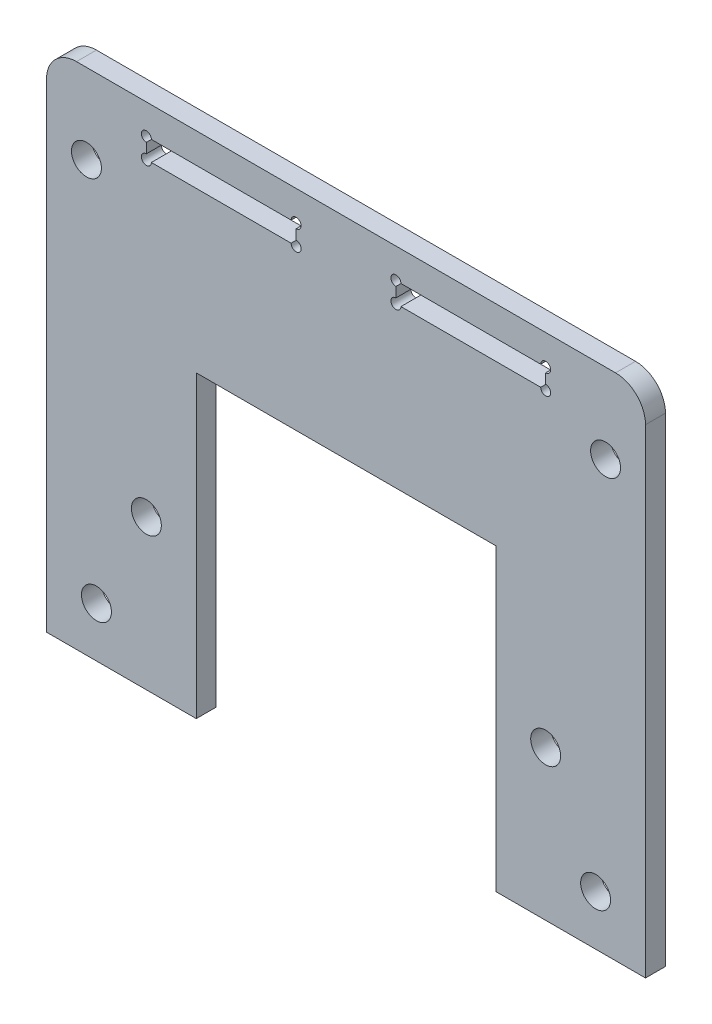
ISO-10303-21;
HEADER;
FILE_DESCRIPTION(('STEP AP214'),'2;1');
FILE_NAME('part.step','',(''),(''),'','','');
FILE_SCHEMA(('AUTOMOTIVE_DESIGN { 1 0 10303 214 1 1 1 1 }'));
ENDSEC;
DATA;
#1=APPLICATION_CONTEXT('core data for automotive mechanical design processes');
#2=APPLICATION_PROTOCOL_DEFINITION('international standard','automotive_design',2000,#1);
#3=PRODUCT_CONTEXT('',#1,'mechanical');
#4=PRODUCT('Part','Part','',(#3));
#5=PRODUCT_RELATED_PRODUCT_CATEGORY('part','',(#4));
#6=PRODUCT_DEFINITION_FORMATION('','',#4);
#7=PRODUCT_DEFINITION_CONTEXT('part definition',#1,'design');
#8=PRODUCT_DEFINITION('design','',#6,#7);
#9=PRODUCT_DEFINITION_SHAPE('','',#8);
#10=(LENGTH_UNIT() NAMED_UNIT(*) SI_UNIT(.MILLI.,.METRE.));
#11=(NAMED_UNIT(*) PLANE_ANGLE_UNIT() SI_UNIT($,.RADIAN.));
#12=(NAMED_UNIT(*) SI_UNIT($,.STERADIAN.) SOLID_ANGLE_UNIT());
#13=UNCERTAINTY_MEASURE_WITH_UNIT(LENGTH_MEASURE(1.E-05),#10,'distance_accuracy_value','');
#14=(GEOMETRIC_REPRESENTATION_CONTEXT(3) GLOBAL_UNCERTAINTY_ASSIGNED_CONTEXT((#13)) GLOBAL_UNIT_ASSIGNED_CONTEXT((#10,
#11,#12)) REPRESENTATION_CONTEXT('',''));
#15=CARTESIAN_POINT('',(0.,0.,0.));
#16=DIRECTION('',(0.,0.,1.));
#17=DIRECTION('',(1.,0.,0.));
#18=AXIS2_PLACEMENT_3D('',#15,#16,#17);
#19=CARTESIAN_POINT('',(20.,24.,-8.));
#20=DIRECTION('',(-1.,0.,0.));
#21=DIRECTION('',(0.,0.,1.));
#22=AXIS2_PLACEMENT_3D('',#19,#20,#21);
#23=PLANE('',#22);
#24=DIRECTION('',(0.,0.,1.));
#25=VECTOR('',#24,1.);
#26=CARTESIAN_POINT('',(20.,22.5,-8.));
#27=LINE('',#26,#25);
#28=CARTESIAN_POINT('',(20.,22.5,0.));
#29=VERTEX_POINT('',#28);
#30=CARTESIAN_POINT('',(20.,22.5,2.));
#31=VERTEX_POINT('',#30);
#32=EDGE_CURVE('E211',#29,#31,#27,.T.);
#33=ORIENTED_EDGE('',*,*,#32,.T.);
#34=DIRECTION('',(0.,1.,0.));
#35=VECTOR('',#34,1.);
#36=CARTESIAN_POINT('',(20.,24.,2.));
#37=LINE('',#36,#35);
#38=CARTESIAN_POINT('',(20.,23.5,2.));
#39=VERTEX_POINT('',#38);
#40=EDGE_CURVE('E198',#31,#39,#37,.T.);
#41=ORIENTED_EDGE('',*,*,#40,.T.);
#42=DIRECTION('',(0.,0.,1.));
#43=VECTOR('',#42,1.);
#44=CARTESIAN_POINT('',(20.,23.5,0.));
#45=LINE('',#44,#43);
#46=CARTESIAN_POINT('',(20.,23.5,0.));
#47=VERTEX_POINT('',#46);
#48=EDGE_CURVE('E209',#39,#47,#45,.F.);
#49=ORIENTED_EDGE('',*,*,#48,.T.);
#50=DIRECTION('',(0.,1.,0.));
#51=VECTOR('',#50,1.);
#52=CARTESIAN_POINT('',(20.,24.,0.));
#53=LINE('',#52,#51);
#54=EDGE_CURVE('E213',#47,#29,#53,.F.);
#55=ORIENTED_EDGE('',*,*,#54,.T.);
#56=EDGE_LOOP('',(#33,#41,#49,#55));
#57=FACE_BOUND('',#56,.T.);
#58=ADVANCED_FACE('F17',(#57),#23,.T.);
#59=CARTESIAN_POINT('',(-5.,24.,-8.));
#60=DIRECTION('',(-1.,0.,0.));
#61=DIRECTION('',(0.,0.,1.));
#62=AXIS2_PLACEMENT_3D('',#59,#60,#61);
#63=PLANE('',#62);
#64=DIRECTION('',(0.,0.,1.));
#65=VECTOR('',#64,1.);
#66=CARTESIAN_POINT('',(-5.,22.5,-8.));
#67=LINE('',#66,#65);
#68=CARTESIAN_POINT('',(-5.,22.5,0.));
#69=VERTEX_POINT('',#68);
#70=CARTESIAN_POINT('',(-5.,22.5,2.));
#71=VERTEX_POINT('',#70);
#72=EDGE_CURVE('E205',#69,#71,#67,.T.);
#73=ORIENTED_EDGE('',*,*,#72,.T.);
#74=DIRECTION('',(0.,1.,0.));
#75=VECTOR('',#74,1.);
#76=CARTESIAN_POINT('',(-5.,24.,2.));
#77=LINE('',#76,#75);
#78=CARTESIAN_POINT('',(-5.,23.5,2.));
#79=VERTEX_POINT('',#78);
#80=EDGE_CURVE('E216',#71,#79,#77,.T.);
#81=ORIENTED_EDGE('',*,*,#80,.T.);
#82=DIRECTION('',(0.,0.,1.));
#83=VECTOR('',#82,1.);
#84=CARTESIAN_POINT('',(-5.,23.5,0.));
#85=LINE('',#84,#83);
#86=CARTESIAN_POINT('',(-5.,23.5,0.));
#87=VERTEX_POINT('',#86);
#88=EDGE_CURVE('E218',#79,#87,#85,.F.);
#89=ORIENTED_EDGE('',*,*,#88,.T.);
#90=DIRECTION('',(0.,1.,0.));
#91=VECTOR('',#90,1.);
#92=CARTESIAN_POINT('',(-5.,24.,0.));
#93=LINE('',#92,#91);
#94=EDGE_CURVE('E212',#87,#69,#93,.F.);
#95=ORIENTED_EDGE('',*,*,#94,.T.);
#96=EDGE_LOOP('',(#73,#81,#89,#95));
#97=FACE_BOUND('',#96,.T.);
#98=ADVANCED_FACE('F457',(#97),#63,.T.);
#99=CARTESIAN_POINT('',(20.,24.,0.));
#100=DIRECTION('',(0.,0.,1.));
#101=DIRECTION('',(1.,0.,0.));
#102=AXIS2_PLACEMENT_3D('',#99,#100,#101);
#103=CYLINDRICAL_SURFACE('',#102,0.5);
#104=CARTESIAN_POINT('',(20.,24.,0.));
#105=DIRECTION('',(0.,0.,1.));
#106=DIRECTION('',(1.,0.,0.));
#107=AXIS2_PLACEMENT_3D('',#104,#105,#106);
#108=CIRCLE('',#107,0.5);
#109=CARTESIAN_POINT('',(19.5,24.,0.));
#110=VERTEX_POINT('',#109);
#111=EDGE_CURVE('E188',#110,#47,#108,.F.);
#112=ORIENTED_EDGE('',*,*,#111,.T.);
#113=ORIENTED_EDGE('',*,*,#48,.F.);
#114=CARTESIAN_POINT('',(20.,24.,2.));
#115=DIRECTION('',(0.,0.,1.));
#116=DIRECTION('',(1.,0.,0.));
#117=AXIS2_PLACEMENT_3D('',#114,#115,#116);
#118=CIRCLE('',#117,0.5);
#119=CARTESIAN_POINT('',(19.5,24.,2.));
#120=VERTEX_POINT('',#119);
#121=EDGE_CURVE('E20',#120,#39,#118,.F.);
#122=ORIENTED_EDGE('',*,*,#121,.F.);
#123=DIRECTION('',(0.,0.,-1.));
#124=VECTOR('',#123,1.);
#125=CARTESIAN_POINT('',(19.5,24.,0.));
#126=LINE('',#125,#124);
#127=EDGE_CURVE('E337',#110,#120,#126,.F.);
#128=ORIENTED_EDGE('',*,*,#127,.F.);
#129=EDGE_LOOP('',(#112,#113,#122,#128));
#130=FACE_BOUND('',#129,.T.);
#131=ADVANCED_FACE('F215',(#130),#103,.F.);
#132=CARTESIAN_POINT('',(20.,22.,-8.));
#133=DIRECTION('',(0.,0.,1.));
#134=DIRECTION('',(1.,0.,0.));
#135=AXIS2_PLACEMENT_3D('',#132,#133,#134);
#136=CYLINDRICAL_SURFACE('',#135,0.5);
#137=CARTESIAN_POINT('',(20.,22.,0.));
#138=DIRECTION('',(0.,0.,1.));
#139=DIRECTION('',(1.,0.,0.));
#140=AXIS2_PLACEMENT_3D('',#137,#138,#139);
#141=CIRCLE('',#140,0.5);
#142=CARTESIAN_POINT('',(19.5,22.,0.));
#143=VERTEX_POINT('',#142);
#144=EDGE_CURVE('E308',#29,#143,#141,.F.);
#145=ORIENTED_EDGE('',*,*,#144,.T.);
#146=DIRECTION('',(0.,0.,-1.));
#147=VECTOR('',#146,1.);
#148=CARTESIAN_POINT('',(19.5,22.,-8.));
#149=LINE('',#148,#147);
#150=CARTESIAN_POINT('',(19.5,22.,2.));
#151=VERTEX_POINT('',#150);
#152=EDGE_CURVE('E333',#143,#151,#149,.F.);
#153=ORIENTED_EDGE('',*,*,#152,.T.);
#154=CARTESIAN_POINT('',(20.,22.,2.));
#155=DIRECTION('',(0.,0.,1.));
#156=DIRECTION('',(1.,0.,0.));
#157=AXIS2_PLACEMENT_3D('',#154,#155,#156);
#158=CIRCLE('',#157,0.5);
#159=EDGE_CURVE('E204',#31,#151,#158,.F.);
#160=ORIENTED_EDGE('',*,*,#159,.F.);
#161=ORIENTED_EDGE('',*,*,#32,.F.);
#162=EDGE_LOOP('',(#145,#153,#160,#161));
#163=FACE_BOUND('',#162,.T.);
#164=ADVANCED_FACE('F345',(#163),#136,.F.);
#165=CARTESIAN_POINT('',(4.99999999999999,24.,-8.));
#166=DIRECTION('',(-1.,0.,0.));
#167=DIRECTION('',(0.,0.,1.));
#168=AXIS2_PLACEMENT_3D('',#165,#166,#167);
#169=PLANE('',#168);
#170=DIRECTION('',(0.,0.,1.));
#171=VECTOR('',#170,1.);
#172=CARTESIAN_POINT('',(4.99999999999999,23.5,0.));
#173=LINE('',#172,#171);
#174=CARTESIAN_POINT('',(4.99999999999999,23.5,0.));
#175=VERTEX_POINT('',#174);
#176=CARTESIAN_POINT('',(4.99999999999999,23.5,2.));
#177=VERTEX_POINT('',#176);
#178=EDGE_CURVE('E300',#175,#177,#173,.T.);
#179=ORIENTED_EDGE('',*,*,#178,.T.);
#180=DIRECTION('',(0.,1.,0.));
#181=VECTOR('',#180,1.);
#182=CARTESIAN_POINT('',(4.99999999999999,24.,2.));
#183=LINE('',#182,#181);
#184=CARTESIAN_POINT('',(4.99999999999999,22.5,2.));
#185=VERTEX_POINT('',#184);
#186=EDGE_CURVE('E320',#185,#177,#183,.T.);
#187=ORIENTED_EDGE('',*,*,#186,.F.);
#188=DIRECTION('',(0.,0.,1.));
#189=VECTOR('',#188,1.);
#190=CARTESIAN_POINT('',(4.99999999999999,22.5,-8.));
#191=LINE('',#190,#189);
#192=CARTESIAN_POINT('',(4.99999999999999,22.5,0.));
#193=VERTEX_POINT('',#192);
#194=EDGE_CURVE('E295',#185,#193,#191,.F.);
#195=ORIENTED_EDGE('',*,*,#194,.T.);
#196=DIRECTION('',(0.,1.,0.));
#197=VECTOR('',#196,1.);
#198=CARTESIAN_POINT('',(4.99999999999999,0.,0.));
#199=LINE('',#198,#197);
#200=EDGE_CURVE('E307',#193,#175,#199,.T.);
#201=ORIENTED_EDGE('',*,*,#200,.T.);
#202=EDGE_LOOP('',(#179,#187,#195,#201));
#203=FACE_BOUND('',#202,.T.);
#204=ADVANCED_FACE('F585',(#203),#169,.F.);
#205=CARTESIAN_POINT('',(-5.00000000000001,24.,0.));
#206=DIRECTION('',(0.,0.,1.));
#207=DIRECTION('',(1.,0.,0.));
#208=AXIS2_PLACEMENT_3D('',#205,#206,#207);
#209=CYLINDRICAL_SURFACE('',#208,0.5);
#210=CARTESIAN_POINT('',(-5.00000000000001,24.,0.));
#211=DIRECTION('',(0.,0.,1.));
#212=DIRECTION('',(1.,0.,0.));
#213=AXIS2_PLACEMENT_3D('',#210,#211,#212);
#214=CIRCLE('',#213,0.5);
#215=CARTESIAN_POINT('',(-5.50000000000001,24.,0.));
#216=VERTEX_POINT('',#215);
#217=EDGE_CURVE('E314',#216,#87,#214,.F.);
#218=ORIENTED_EDGE('',*,*,#217,.T.);
#219=ORIENTED_EDGE('',*,*,#88,.F.);
#220=CARTESIAN_POINT('',(-5.00000000000001,24.,2.));
#221=DIRECTION('',(0.,0.,1.));
#222=DIRECTION('',(1.,0.,0.));
#223=AXIS2_PLACEMENT_3D('',#220,#221,#222);
#224=CIRCLE('',#223,0.5);
#225=CARTESIAN_POINT('',(-5.50000000000001,24.,2.));
#226=VERTEX_POINT('',#225);
#227=EDGE_CURVE('E319',#226,#79,#224,.F.);
#228=ORIENTED_EDGE('',*,*,#227,.F.);
#229=DIRECTION('',(0.,0.,-1.));
#230=VECTOR('',#229,1.);
#231=CARTESIAN_POINT('',(-5.50000000000001,24.,0.));
#232=LINE('',#231,#230);
#233=EDGE_CURVE('E410',#216,#226,#232,.F.);
#234=ORIENTED_EDGE('',*,*,#233,.F.);
#235=EDGE_LOOP('',(#218,#219,#228,#234));
#236=FACE_BOUND('',#235,.T.);
#237=ADVANCED_FACE('F463',(#236),#209,.F.);
#238=CARTESIAN_POINT('',(-5.,22.,-8.));
#239=DIRECTION('',(0.,0.,1.));
#240=DIRECTION('',(1.,0.,0.));
#241=AXIS2_PLACEMENT_3D('',#238,#239,#240);
#242=CYLINDRICAL_SURFACE('',#241,0.5);
#243=CARTESIAN_POINT('',(-5.,22.,0.));
#244=DIRECTION('',(0.,0.,1.));
#245=DIRECTION('',(1.,0.,0.));
#246=AXIS2_PLACEMENT_3D('',#243,#244,#245);
#247=CIRCLE('',#246,0.5);
#248=CARTESIAN_POINT('',(-5.50000000000001,22.,0.));
#249=VERTEX_POINT('',#248);
#250=EDGE_CURVE('E312',#69,#249,#247,.F.);
#251=ORIENTED_EDGE('',*,*,#250,.T.);
#252=DIRECTION('',(0.,0.,-1.));
#253=VECTOR('',#252,1.);
#254=CARTESIAN_POINT('',(-5.50000000000001,22.,-8.));
#255=LINE('',#254,#253);
#256=CARTESIAN_POINT('',(-5.50000000000001,22.,2.));
#257=VERTEX_POINT('',#256);
#258=EDGE_CURVE('E407',#249,#257,#255,.F.);
#259=ORIENTED_EDGE('',*,*,#258,.T.);
#260=CARTESIAN_POINT('',(-5.,22.,2.));
#261=DIRECTION('',(0.,0.,1.));
#262=DIRECTION('',(1.,0.,0.));
#263=AXIS2_PLACEMENT_3D('',#260,#261,#262);
#264=CIRCLE('',#263,0.5);
#265=EDGE_CURVE('E317',#71,#257,#264,.F.);
#266=ORIENTED_EDGE('',*,*,#265,.F.);
#267=ORIENTED_EDGE('',*,*,#72,.F.);
#268=EDGE_LOOP('',(#251,#259,#266,#267));
#269=FACE_BOUND('',#268,.T.);
#270=ADVANCED_FACE('F453',(#269),#242,.F.);
#271=CARTESIAN_POINT('',(-20.,24.,-8.));
#272=DIRECTION('',(-1.,0.,0.));
#273=DIRECTION('',(0.,0.,1.));
#274=AXIS2_PLACEMENT_3D('',#271,#272,#273);
#275=PLANE('',#274);
#276=DIRECTION('',(0.,0.,1.));
#277=VECTOR('',#276,1.);
#278=CARTESIAN_POINT('',(-20.,23.5,0.));
#279=LINE('',#278,#277);
#280=CARTESIAN_POINT('',(-20.,23.5,0.));
#281=VERTEX_POINT('',#280);
#282=CARTESIAN_POINT('',(-20.,23.5,2.));
#283=VERTEX_POINT('',#282);
#284=EDGE_CURVE('E291',#281,#283,#279,.T.);
#285=ORIENTED_EDGE('',*,*,#284,.T.);
#286=DIRECTION('',(0.,1.,0.));
#287=VECTOR('',#286,1.);
#288=CARTESIAN_POINT('',(-20.,24.,2.));
#289=LINE('',#288,#287);
#290=CARTESIAN_POINT('',(-20.,22.5,2.));
#291=VERTEX_POINT('',#290);
#292=EDGE_CURVE('E316',#291,#283,#289,.T.);
#293=ORIENTED_EDGE('',*,*,#292,.F.);
#294=DIRECTION('',(0.,0.,1.));
#295=VECTOR('',#294,1.);
#296=CARTESIAN_POINT('',(-20.,22.5,-8.));
#297=LINE('',#296,#295);
#298=CARTESIAN_POINT('',(-20.,22.5,0.));
#299=VERTEX_POINT('',#298);
#300=EDGE_CURVE('E286',#291,#299,#297,.F.);
#301=ORIENTED_EDGE('',*,*,#300,.T.);
#302=DIRECTION('',(0.,1.,0.));
#303=VECTOR('',#302,1.);
#304=CARTESIAN_POINT('',(-20.,0.,0.));
#305=LINE('',#304,#303);
#306=EDGE_CURVE('E311',#299,#281,#305,.T.);
#307=ORIENTED_EDGE('',*,*,#306,.T.);
#308=EDGE_LOOP('',(#285,#293,#301,#307));
#309=FACE_BOUND('',#308,.T.);
#310=ADVANCED_FACE('F573',(#309),#275,.F.);
#311=CARTESIAN_POINT('',(0.,0.,0.));
#312=DIRECTION('',(0.,0.,1.));
#313=DIRECTION('',(1.,0.,0.));
#314=AXIS2_PLACEMENT_3D('',#311,#312,#313);
#315=PLANE('',#314);
#316=CARTESIAN_POINT('',(25.,-19.,0.));
#317=DIRECTION('',(0.,0.,1.));
#318=DIRECTION('',(1.,0.,0.));
#319=AXIS2_PLACEMENT_3D('',#316,#317,#318);
#320=CIRCLE('',#319,1.5);
#321=CARTESIAN_POINT('',(26.5,-19.,0.));
#322=VERTEX_POINT('',#321);
#323=EDGE_CURVE('E261',#322,#322,#320,.T.);
#324=ORIENTED_EDGE('',*,*,#323,.T.);
#325=EDGE_LOOP('',(#324));
#326=FACE_BOUND('',#325,.T.);
#327=CARTESIAN_POINT('',(20.,-9.,0.));
#328=DIRECTION('',(0.,0.,1.));
#329=DIRECTION('',(1.,0.,0.));
#330=AXIS2_PLACEMENT_3D('',#327,#328,#329);
#331=CIRCLE('',#330,1.5);
#332=CARTESIAN_POINT('',(21.5,-9.,0.));
#333=VERTEX_POINT('',#332);
#334=EDGE_CURVE('E264',#333,#333,#331,.T.);
#335=ORIENTED_EDGE('',*,*,#334,.T.);
#336=EDGE_LOOP('',(#335));
#337=FACE_BOUND('',#336,.T.);
#338=CARTESIAN_POINT('',(-20.,-9.,0.));
#339=DIRECTION('',(0.,0.,1.));
#340=DIRECTION('',(1.,0.,0.));
#341=AXIS2_PLACEMENT_3D('',#338,#339,#340);
#342=CIRCLE('',#341,1.5);
#343=CARTESIAN_POINT('',(-18.5,-9.,0.));
#344=VERTEX_POINT('',#343);
#345=EDGE_CURVE('E267',#344,#344,#342,.T.);
#346=ORIENTED_EDGE('',*,*,#345,.T.);
#347=EDGE_LOOP('',(#346));
#348=FACE_BOUND('',#347,.T.);
#349=CARTESIAN_POINT('',(-25.,-19.,0.));
#350=DIRECTION('',(0.,0.,1.));
#351=DIRECTION('',(1.,0.,0.));
#352=AXIS2_PLACEMENT_3D('',#349,#350,#351);
#353=CIRCLE('',#352,1.5);
#354=CARTESIAN_POINT('',(-23.5,-19.,0.));
#355=VERTEX_POINT('',#354);
#356=EDGE_CURVE('E270',#355,#355,#353,.T.);
#357=ORIENTED_EDGE('',*,*,#356,.T.);
#358=EDGE_LOOP('',(#357));
#359=FACE_BOUND('',#358,.T.);
#360=CARTESIAN_POINT('',(5.,24.,0.));
#361=DIRECTION('',(0.,0.,1.));
#362=DIRECTION('',(1.,0.,0.));
#363=AXIS2_PLACEMENT_3D('',#360,#361,#362);
#364=CIRCLE('',#363,0.499999999999999);
#365=CARTESIAN_POINT('',(5.5,24.,0.));
#366=VERTEX_POINT('',#365);
#367=EDGE_CURVE('E296',#366,#175,#364,.T.);
#368=ORIENTED_EDGE('',*,*,#367,.T.);
#369=ORIENTED_EDGE('',*,*,#200,.F.);
#370=CARTESIAN_POINT('',(5.,22.,0.));
#371=DIRECTION('',(0.,0.,1.));
#372=DIRECTION('',(1.,0.,0.));
#373=AXIS2_PLACEMENT_3D('',#370,#371,#372);
#374=CIRCLE('',#373,0.499999999999999);
#375=CARTESIAN_POINT('',(5.5,22.,0.));
#376=VERTEX_POINT('',#375);
#377=EDGE_CURVE('E292',#193,#376,#374,.T.);
#378=ORIENTED_EDGE('',*,*,#377,.T.);
#379=DIRECTION('',(1.,0.,0.));
#380=VECTOR('',#379,1.);
#381=CARTESIAN_POINT('',(4.99999999999999,22.,0.));
#382=LINE('',#381,#380);
#383=EDGE_CURVE('E329',#376,#143,#382,.T.);
#384=ORIENTED_EDGE('',*,*,#383,.T.);
#385=ORIENTED_EDGE('',*,*,#144,.F.);
#386=ORIENTED_EDGE('',*,*,#54,.F.);
#387=ORIENTED_EDGE('',*,*,#111,.F.);
#388=DIRECTION('',(1.,0.,0.));
#389=VECTOR('',#388,1.);
#390=CARTESIAN_POINT('',(-30.,24.,0.));
#391=LINE('',#390,#389);
#392=EDGE_CURVE('E334',#366,#110,#391,.T.);
#393=ORIENTED_EDGE('',*,*,#392,.F.);
#394=EDGE_LOOP('',(#368,#369,#378,#384,#385,#386,#387,#393));
#395=FACE_BOUND('',#394,.T.);
#396=CARTESIAN_POINT('',(-20.,24.,0.));
#397=DIRECTION('',(0.,0.,1.));
#398=DIRECTION('',(1.,0.,0.));
#399=AXIS2_PLACEMENT_3D('',#396,#397,#398);
#400=CIRCLE('',#399,0.5);
#401=CARTESIAN_POINT('',(-19.5,24.,0.));
#402=VERTEX_POINT('',#401);
#403=EDGE_CURVE('E287',#402,#281,#400,.T.);
#404=ORIENTED_EDGE('',*,*,#403,.T.);
#405=ORIENTED_EDGE('',*,*,#306,.F.);
#406=CARTESIAN_POINT('',(-20.,22.,0.));
#407=DIRECTION('',(0.,0.,1.));
#408=DIRECTION('',(1.,0.,0.));
#409=AXIS2_PLACEMENT_3D('',#406,#407,#408);
#410=CIRCLE('',#409,0.5);
#411=CARTESIAN_POINT('',(-19.5,22.,0.));
#412=VERTEX_POINT('',#411);
#413=EDGE_CURVE('E283',#299,#412,#410,.T.);
#414=ORIENTED_EDGE('',*,*,#413,.T.);
#415=DIRECTION('',(1.,0.,0.));
#416=VECTOR('',#415,1.);
#417=CARTESIAN_POINT('',(-20.,22.,0.));
#418=LINE('',#417,#416);
#419=EDGE_CURVE('E405',#412,#249,#418,.T.);
#420=ORIENTED_EDGE('',*,*,#419,.T.);
#421=ORIENTED_EDGE('',*,*,#250,.F.);
#422=ORIENTED_EDGE('',*,*,#94,.F.);
#423=ORIENTED_EDGE('',*,*,#217,.F.);
#424=DIRECTION('',(1.,0.,0.));
#425=VECTOR('',#424,1.);
#426=CARTESIAN_POINT('',(-30.,24.,0.));
#427=LINE('',#426,#425);
#428=EDGE_CURVE('E327',#402,#216,#427,.T.);
#429=ORIENTED_EDGE('',*,*,#428,.F.);
#430=EDGE_LOOP('',(#404,#405,#414,#420,#421,#422,#423,#429));
#431=FACE_BOUND('',#430,.T.);
#432=CARTESIAN_POINT('',(27.,24.,0.));
#433=DIRECTION('',(0.,0.,1.));
#434=DIRECTION('',(1.,0.,0.));
#435=AXIS2_PLACEMENT_3D('',#432,#433,#434);
#436=CIRCLE('',#435,3.);
#437=CARTESIAN_POINT('',(30.,24.,0.));
#438=VERTEX_POINT('',#437);
#439=CARTESIAN_POINT('',(27.,27.,0.));
#440=VERTEX_POINT('',#439);
#441=EDGE_CURVE('E278',#438,#440,#436,.T.);
#442=ORIENTED_EDGE('',*,*,#441,.F.);
#443=DIRECTION('',(0.,-1.,0.));
#444=VECTOR('',#443,1.);
#445=CARTESIAN_POINT('',(30.,24.,0.));
#446=LINE('',#445,#444);
#447=CARTESIAN_POINT('',(30.,-24.,0.));
#448=VERTEX_POINT('',#447);
#449=EDGE_CURVE('E282',#438,#448,#446,.T.);
#450=ORIENTED_EDGE('',*,*,#449,.T.);
#451=DIRECTION('',(1.,0.,0.));
#452=VECTOR('',#451,1.);
#453=CARTESIAN_POINT('',(-30.,-24.,0.));
#454=LINE('',#453,#452);
#455=CARTESIAN_POINT('',(15.,-24.,0.));
#456=VERTEX_POINT('',#455);
#457=EDGE_CURVE('E359',#448,#456,#454,.F.);
#458=ORIENTED_EDGE('',*,*,#457,.T.);
#459=DIRECTION('',(0.,1.,0.));
#460=VECTOR('',#459,1.);
#461=CARTESIAN_POINT('',(15.,-54.,0.));
#462=LINE('',#461,#460);
#463=CARTESIAN_POINT('',(15.,6.00000000000001,0.));
#464=VERTEX_POINT('',#463);
#465=EDGE_CURVE('E363',#456,#464,#462,.T.);
#466=ORIENTED_EDGE('',*,*,#465,.T.);
#467=DIRECTION('',(1.,0.,0.));
#468=VECTOR('',#467,1.);
#469=CARTESIAN_POINT('',(-15.,6.00000000000001,0.));
#470=LINE('',#469,#468);
#471=CARTESIAN_POINT('',(-15.,6.00000000000001,0.));
#472=VERTEX_POINT('',#471);
#473=EDGE_CURVE('E367',#464,#472,#470,.F.);
#474=ORIENTED_EDGE('',*,*,#473,.T.);
#475=DIRECTION('',(0.,1.,0.));
#476=VECTOR('',#475,1.);
#477=CARTESIAN_POINT('',(-15.,-54.,0.));
#478=LINE('',#477,#476);
#479=CARTESIAN_POINT('',(-15.,-24.,0.));
#480=VERTEX_POINT('',#479);
#481=EDGE_CURVE('E369',#472,#480,#478,.F.);
#482=ORIENTED_EDGE('',*,*,#481,.T.);
#483=DIRECTION('',(1.,0.,0.));
#484=VECTOR('',#483,1.);
#485=CARTESIAN_POINT('',(-30.,-24.,0.));
#486=LINE('',#485,#484);
#487=CARTESIAN_POINT('',(-30.,-24.,0.));
#488=VERTEX_POINT('',#487);
#489=EDGE_CURVE('E374',#480,#488,#486,.F.);
#490=ORIENTED_EDGE('',*,*,#489,.T.);
#491=DIRECTION('',(0.,1.,0.));
#492=VECTOR('',#491,1.);
#493=CARTESIAN_POINT('',(-30.,24.,0.));
#494=LINE('',#493,#492);
#495=CARTESIAN_POINT('',(-30.,24.,0.));
#496=VERTEX_POINT('',#495);
#497=EDGE_CURVE('E378',#488,#496,#494,.T.);
#498=ORIENTED_EDGE('',*,*,#497,.T.);
#499=CARTESIAN_POINT('',(-27.,24.,0.));
#500=DIRECTION('',(0.,0.,1.));
#501=DIRECTION('',(1.,0.,0.));
#502=AXIS2_PLACEMENT_3D('',#499,#500,#501);
#503=CIRCLE('',#502,3.);
#504=CARTESIAN_POINT('',(-27.,27.,0.));
#505=VERTEX_POINT('',#504);
#506=EDGE_CURVE('E273',#505,#496,#503,.T.);
#507=ORIENTED_EDGE('',*,*,#506,.F.);
#508=DIRECTION('',(1.,0.,0.));
#509=VECTOR('',#508,1.);
#510=CARTESIAN_POINT('',(-30.,27.,0.));
#511=LINE('',#510,#509);
#512=EDGE_CURVE('E391',#505,#440,#511,.T.);
#513=ORIENTED_EDGE('',*,*,#512,.T.);
#514=EDGE_LOOP('',(#442,#450,#458,#466,#474,#482,#490,#498,#507,#513));
#515=FACE_BOUND('',#514,.T.);
#516=CARTESIAN_POINT('',(26.,19.,0.));
#517=DIRECTION('',(0.,0.,1.));
#518=DIRECTION('',(1.,0.,0.));
#519=AXIS2_PLACEMENT_3D('',#516,#517,#518);
#520=CIRCLE('',#519,1.5);
#521=CARTESIAN_POINT('',(27.5,19.,0.));
#522=VERTEX_POINT('',#521);
#523=EDGE_CURVE('E301',#522,#522,#520,.T.);
#524=ORIENTED_EDGE('',*,*,#523,.T.);
#525=EDGE_LOOP('',(#524));
#526=FACE_BOUND('',#525,.T.);
#527=CARTESIAN_POINT('',(-26.,19.,0.));
#528=DIRECTION('',(0.,0.,1.));
#529=DIRECTION('',(1.,0.,0.));
#530=AXIS2_PLACEMENT_3D('',#527,#528,#529);
#531=CIRCLE('',#530,1.5);
#532=CARTESIAN_POINT('',(-24.5,19.,0.));
#533=VERTEX_POINT('',#532);
#534=EDGE_CURVE('E304',#533,#533,#531,.T.);
#535=ORIENTED_EDGE('',*,*,#534,.T.);
#536=EDGE_LOOP('',(#535));
#537=FACE_BOUND('',#536,.T.);
#538=ADVANCED_FACE('F442',(#326,#337,#348,#359,#395,#431,#515,#526,#537),#315,.F.);
#539=CARTESIAN_POINT('',(-26.,19.,0.));
#540=DIRECTION('',(0.,0.,1.));
#541=DIRECTION('',(1.,0.,0.));
#542=AXIS2_PLACEMENT_3D('',#539,#540,#541);
#543=CYLINDRICAL_SURFACE('',#542,1.5);
#544=CARTESIAN_POINT('',(-26.,19.,2.));
#545=DIRECTION('',(0.,0.,1.));
#546=DIRECTION('',(1.,0.,0.));
#547=AXIS2_PLACEMENT_3D('',#544,#545,#546);
#548=CIRCLE('',#547,1.5);
#549=CARTESIAN_POINT('',(-24.5,19.,2.));
#550=VERTEX_POINT('',#549);
#551=EDGE_CURVE('E258',#550,#550,#548,.F.);
#552=ORIENTED_EDGE('',*,*,#551,.F.);
#553=EDGE_LOOP('',(#552));
#554=FACE_BOUND('',#553,.T.);
#555=ORIENTED_EDGE('',*,*,#534,.F.);
#556=EDGE_LOOP('',(#555));
#557=FACE_BOUND('',#556,.T.);
#558=ADVANCED_FACE('F572',(#554,#557),#543,.F.);
#559=CARTESIAN_POINT('',(26.,19.,0.));
#560=DIRECTION('',(0.,0.,1.));
#561=DIRECTION('',(1.,0.,0.));
#562=AXIS2_PLACEMENT_3D('',#559,#560,#561);
#563=CYLINDRICAL_SURFACE('',#562,1.5);
#564=CARTESIAN_POINT('',(26.,19.,2.));
#565=DIRECTION('',(0.,0.,1.));
#566=DIRECTION('',(1.,0.,0.));
#567=AXIS2_PLACEMENT_3D('',#564,#565,#566);
#568=CIRCLE('',#567,1.5);
#569=CARTESIAN_POINT('',(27.5,19.,2.));
#570=VERTEX_POINT('',#569);
#571=EDGE_CURVE('E255',#570,#570,#568,.F.);
#572=ORIENTED_EDGE('',*,*,#571,.F.);
#573=EDGE_LOOP('',(#572));
#574=FACE_BOUND('',#573,.T.);
#575=ORIENTED_EDGE('',*,*,#523,.F.);
#576=EDGE_LOOP('',(#575));
#577=FACE_BOUND('',#576,.T.);
#578=ADVANCED_FACE('F605',(#574,#577),#563,.F.);
#579=CARTESIAN_POINT('',(5.,24.,0.));
#580=DIRECTION('',(0.,0.,1.));
#581=DIRECTION('',(1.,0.,0.));
#582=AXIS2_PLACEMENT_3D('',#579,#580,#581);
#583=CYLINDRICAL_SURFACE('',#582,0.499999999999999);
#584=DIRECTION('',(0.,0.,-1.));
#585=VECTOR('',#584,1.);
#586=CARTESIAN_POINT('',(5.49999999999999,24.,0.));
#587=LINE('',#586,#585);
#588=CARTESIAN_POINT('',(5.5,24.,2.));
#589=VERTEX_POINT('',#588);
#590=EDGE_CURVE('E299',#589,#366,#587,.T.);
#591=ORIENTED_EDGE('',*,*,#590,.F.);
#592=CARTESIAN_POINT('',(5.,24.,2.));
#593=DIRECTION('',(0.,0.,1.));
#594=DIRECTION('',(1.,0.,0.));
#595=AXIS2_PLACEMENT_3D('',#592,#593,#594);
#596=CIRCLE('',#595,0.499999999999999);
#597=EDGE_CURVE('E253',#177,#589,#596,.F.);
#598=ORIENTED_EDGE('',*,*,#597,.F.);
#599=ORIENTED_EDGE('',*,*,#178,.F.);
#600=ORIENTED_EDGE('',*,*,#367,.F.);
#601=EDGE_LOOP('',(#591,#598,#599,#600));
#602=FACE_BOUND('',#601,.T.);
#603=ADVANCED_FACE('F583',(#602),#583,.F.);
#604=CARTESIAN_POINT('',(-30.,24.,0.));
#605=DIRECTION('',(0.,-1.,0.));
#606=DIRECTION('',(0.,0.,-1.));
#607=AXIS2_PLACEMENT_3D('',#604,#605,#606);
#608=PLANE('',#607);
#609=ORIENTED_EDGE('',*,*,#127,.T.);
#610=DIRECTION('',(1.,0.,0.));
#611=VECTOR('',#610,1.);
#612=CARTESIAN_POINT('',(0.,24.,2.));
#613=LINE('',#612,#611);
#614=EDGE_CURVE('E202',#589,#120,#613,.T.);
#615=ORIENTED_EDGE('',*,*,#614,.F.);
#616=ORIENTED_EDGE('',*,*,#590,.T.);
#617=ORIENTED_EDGE('',*,*,#392,.T.);
#618=EDGE_LOOP('',(#609,#615,#616,#617));
#619=FACE_BOUND('',#618,.T.);
#620=ADVANCED_FACE('F596',(#619),#608,.T.);
#621=CARTESIAN_POINT('',(4.99999999999999,22.,-8.));
#622=DIRECTION('',(0.,-1.,0.));
#623=DIRECTION('',(0.,0.,-1.));
#624=AXIS2_PLACEMENT_3D('',#621,#622,#623);
#625=PLANE('',#624);
#626=DIRECTION('',(0.,0.,1.));
#627=VECTOR('',#626,1.);
#628=CARTESIAN_POINT('',(5.5,22.,-8.));
#629=LINE('',#628,#627);
#630=CARTESIAN_POINT('',(5.5,22.,2.));
#631=VERTEX_POINT('',#630);
#632=EDGE_CURVE('E332',#376,#631,#629,.T.);
#633=ORIENTED_EDGE('',*,*,#632,.T.);
#634=DIRECTION('',(1.,0.,0.));
#635=VECTOR('',#634,1.);
#636=CARTESIAN_POINT('',(0.,22.,2.));
#637=LINE('',#636,#635);
#638=EDGE_CURVE('E252',#151,#631,#637,.F.);
#639=ORIENTED_EDGE('',*,*,#638,.F.);
#640=ORIENTED_EDGE('',*,*,#152,.F.);
#641=ORIENTED_EDGE('',*,*,#383,.F.);
#642=EDGE_LOOP('',(#633,#639,#640,#641));
#643=FACE_BOUND('',#642,.T.);
#644=ADVANCED_FACE('F350',(#643),#625,.F.);
#645=CARTESIAN_POINT('',(5.,22.,-8.));
#646=DIRECTION('',(0.,0.,1.));
#647=DIRECTION('',(1.,0.,0.));
#648=AXIS2_PLACEMENT_3D('',#645,#646,#647);
#649=CYLINDRICAL_SURFACE('',#648,0.499999999999999);
#650=ORIENTED_EDGE('',*,*,#194,.F.);
#651=CARTESIAN_POINT('',(5.,22.,2.));
#652=DIRECTION('',(0.,0.,1.));
#653=DIRECTION('',(1.,0.,0.));
#654=AXIS2_PLACEMENT_3D('',#651,#652,#653);
#655=CIRCLE('',#654,0.499999999999999);
#656=EDGE_CURVE('E250',#631,#185,#655,.F.);
#657=ORIENTED_EDGE('',*,*,#656,.F.);
#658=ORIENTED_EDGE('',*,*,#632,.F.);
#659=ORIENTED_EDGE('',*,*,#377,.F.);
#660=EDGE_LOOP('',(#650,#657,#658,#659));
#661=FACE_BOUND('',#660,.T.);
#662=ADVANCED_FACE('F588',(#661),#649,.F.);
#663=CARTESIAN_POINT('',(-20.,24.,0.));
#664=DIRECTION('',(0.,0.,1.));
#665=DIRECTION('',(1.,0.,0.));
#666=AXIS2_PLACEMENT_3D('',#663,#664,#665);
#667=CYLINDRICAL_SURFACE('',#666,0.5);
#668=DIRECTION('',(0.,0.,-1.));
#669=VECTOR('',#668,1.);
#670=CARTESIAN_POINT('',(-19.5,24.,0.));
#671=LINE('',#670,#669);
#672=CARTESIAN_POINT('',(-19.5,24.,2.));
#673=VERTEX_POINT('',#672);
#674=EDGE_CURVE('E290',#673,#402,#671,.T.);
#675=ORIENTED_EDGE('',*,*,#674,.F.);
#676=CARTESIAN_POINT('',(-20.,24.,2.));
#677=DIRECTION('',(0.,0.,1.));
#678=DIRECTION('',(1.,0.,0.));
#679=AXIS2_PLACEMENT_3D('',#676,#677,#678);
#680=CIRCLE('',#679,0.5);
#681=EDGE_CURVE('E246',#283,#673,#680,.F.);
#682=ORIENTED_EDGE('',*,*,#681,.F.);
#683=ORIENTED_EDGE('',*,*,#284,.F.);
#684=ORIENTED_EDGE('',*,*,#403,.F.);
#685=EDGE_LOOP('',(#675,#682,#683,#684));
#686=FACE_BOUND('',#685,.T.);
#687=ADVANCED_FACE('F470',(#686),#667,.F.);
#688=CARTESIAN_POINT('',(-30.,24.,0.));
#689=DIRECTION('',(0.,-1.,0.));
#690=DIRECTION('',(0.,0.,-1.));
#691=AXIS2_PLACEMENT_3D('',#688,#689,#690);
#692=PLANE('',#691);
#693=ORIENTED_EDGE('',*,*,#233,.T.);
#694=DIRECTION('',(1.,0.,0.));
#695=VECTOR('',#694,1.);
#696=CARTESIAN_POINT('',(0.,24.,2.));
#697=LINE('',#696,#695);
#698=EDGE_CURVE('E249',#673,#226,#697,.T.);
#699=ORIENTED_EDGE('',*,*,#698,.F.);
#700=ORIENTED_EDGE('',*,*,#674,.T.);
#701=ORIENTED_EDGE('',*,*,#428,.T.);
#702=EDGE_LOOP('',(#693,#699,#700,#701));
#703=FACE_BOUND('',#702,.T.);
#704=ADVANCED_FACE('F467',(#703),#692,.T.);
#705=CARTESIAN_POINT('',(-20.,22.,-8.));
#706=DIRECTION('',(0.,-1.,0.));
#707=DIRECTION('',(0.,0.,-1.));
#708=AXIS2_PLACEMENT_3D('',#705,#706,#707);
#709=PLANE('',#708);
#710=DIRECTION('',(0.,0.,1.));
#711=VECTOR('',#710,1.);
#712=CARTESIAN_POINT('',(-19.5,22.,-8.));
#713=LINE('',#712,#711);
#714=CARTESIAN_POINT('',(-19.5,22.,2.));
#715=VERTEX_POINT('',#714);
#716=EDGE_CURVE('E403',#412,#715,#713,.T.);
#717=ORIENTED_EDGE('',*,*,#716,.T.);
#718=DIRECTION('',(1.,0.,0.));
#719=VECTOR('',#718,1.);
#720=CARTESIAN_POINT('',(0.,22.,2.));
#721=LINE('',#720,#719);
#722=EDGE_CURVE('E245',#257,#715,#721,.F.);
#723=ORIENTED_EDGE('',*,*,#722,.F.);
#724=ORIENTED_EDGE('',*,*,#258,.F.);
#725=ORIENTED_EDGE('',*,*,#419,.F.);
#726=EDGE_LOOP('',(#717,#723,#724,#725));
#727=FACE_BOUND('',#726,.T.);
#728=ADVANCED_FACE('F450',(#727),#709,.F.);
#729=CARTESIAN_POINT('',(-20.,22.,-8.));
#730=DIRECTION('',(0.,0.,1.));
#731=DIRECTION('',(1.,0.,0.));
#732=AXIS2_PLACEMENT_3D('',#729,#730,#731);
#733=CYLINDRICAL_SURFACE('',#732,0.5);
#734=ORIENTED_EDGE('',*,*,#300,.F.);
#735=CARTESIAN_POINT('',(-20.,22.,2.));
#736=DIRECTION('',(0.,0.,1.));
#737=DIRECTION('',(1.,0.,0.));
#738=AXIS2_PLACEMENT_3D('',#735,#736,#737);
#739=CIRCLE('',#738,0.5);
#740=EDGE_CURVE('E242',#715,#291,#739,.F.);
#741=ORIENTED_EDGE('',*,*,#740,.F.);
#742=ORIENTED_EDGE('',*,*,#716,.F.);
#743=ORIENTED_EDGE('',*,*,#413,.F.);
#744=EDGE_LOOP('',(#734,#741,#742,#743));
#745=FACE_BOUND('',#744,.T.);
#746=ADVANCED_FACE('F475',(#745),#733,.F.);
#747=CARTESIAN_POINT('',(30.,24.,2.));
#748=DIRECTION('',(-1.,0.,0.));
#749=DIRECTION('',(0.,-1.,0.));
#750=AXIS2_PLACEMENT_3D('',#747,#748,#749);
#751=PLANE('',#750);
#752=DIRECTION('',(0.,0.,1.));
#753=VECTOR('',#752,1.);
#754=CARTESIAN_POINT('',(30.,24.,2.));
#755=LINE('',#754,#753);
#756=CARTESIAN_POINT('',(30.,24.,2.));
#757=VERTEX_POINT('',#756);
#758=EDGE_CURVE('E281',#757,#438,#755,.F.);
#759=ORIENTED_EDGE('',*,*,#758,.F.);
#760=DIRECTION('',(0.,1.,0.));
#761=VECTOR('',#760,1.);
#762=CARTESIAN_POINT('',(30.,0.,2.));
#763=LINE('',#762,#761);
#764=CARTESIAN_POINT('',(30.,-24.,2.));
#765=VERTEX_POINT('',#764);
#766=EDGE_CURVE('E241',#765,#757,#763,.T.);
#767=ORIENTED_EDGE('',*,*,#766,.F.);
#768=DIRECTION('',(0.,0.,1.));
#769=VECTOR('',#768,1.);
#770=CARTESIAN_POINT('',(30.,-24.,2.));
#771=LINE('',#770,#769);
#772=EDGE_CURVE('E362',#765,#448,#771,.F.);
#773=ORIENTED_EDGE('',*,*,#772,.T.);
#774=ORIENTED_EDGE('',*,*,#449,.F.);
#775=EDGE_LOOP('',(#759,#767,#773,#774));
#776=FACE_BOUND('',#775,.T.);
#777=ADVANCED_FACE('F530',(#776),#751,.F.);
#778=CARTESIAN_POINT('',(27.,24.,2.));
#779=DIRECTION('',(0.,0.,1.));
#780=DIRECTION('',(1.,0.,0.));
#781=AXIS2_PLACEMENT_3D('',#778,#779,#780);
#782=CYLINDRICAL_SURFACE('',#781,3.);
#783=CARTESIAN_POINT('',(27.,24.,2.));
#784=DIRECTION('',(0.,0.,1.));
#785=DIRECTION('',(1.,0.,0.));
#786=AXIS2_PLACEMENT_3D('',#783,#784,#785);
#787=CIRCLE('',#786,3.);
#788=CARTESIAN_POINT('',(27.,27.,2.));
#789=VERTEX_POINT('',#788);
#790=EDGE_CURVE('E238',#757,#789,#787,.T.);
#791=ORIENTED_EDGE('',*,*,#790,.F.);
#792=ORIENTED_EDGE('',*,*,#758,.T.);
#793=ORIENTED_EDGE('',*,*,#441,.T.);
#794=DIRECTION('',(0.,0.,-1.));
#795=VECTOR('',#794,1.);
#796=CARTESIAN_POINT('',(27.,27.,0.));
#797=LINE('',#796,#795);
#798=EDGE_CURVE('E277',#440,#789,#797,.F.);
#799=ORIENTED_EDGE('',*,*,#798,.T.);
#800=EDGE_LOOP('',(#791,#792,#793,#799));
#801=FACE_BOUND('',#800,.T.);
#802=ADVANCED_FACE('F528',(#801),#782,.T.);
#803=CARTESIAN_POINT('',(-30.,27.,0.));
#804=DIRECTION('',(0.,-1.,0.));
#805=DIRECTION('',(0.,0.,-1.));
#806=AXIS2_PLACEMENT_3D('',#803,#804,#805);
#807=PLANE('',#806);
#808=ORIENTED_EDGE('',*,*,#798,.F.);
#809=ORIENTED_EDGE('',*,*,#512,.F.);
#810=DIRECTION('',(0.,0.,1.));
#811=VECTOR('',#810,1.);
#812=CARTESIAN_POINT('',(-27.,27.,0.));
#813=LINE('',#812,#811);
#814=CARTESIAN_POINT('',(-27.,27.,2.));
#815=VERTEX_POINT('',#814);
#816=EDGE_CURVE('E276',#815,#505,#813,.F.);
#817=ORIENTED_EDGE('',*,*,#816,.F.);
#818=DIRECTION('',(1.,0.,0.));
#819=VECTOR('',#818,1.);
#820=CARTESIAN_POINT('',(0.,27.,2.));
#821=LINE('',#820,#819);
#822=EDGE_CURVE('E237',#789,#815,#821,.F.);
#823=ORIENTED_EDGE('',*,*,#822,.F.);
#824=EDGE_LOOP('',(#808,#809,#817,#823));
#825=FACE_BOUND('',#824,.T.);
#826=ADVANCED_FACE('F525',(#825),#807,.F.);
#827=CARTESIAN_POINT('',(-27.,24.,0.));
#828=DIRECTION('',(0.,0.,1.));
#829=DIRECTION('',(1.,0.,0.));
#830=AXIS2_PLACEMENT_3D('',#827,#828,#829);
#831=CYLINDRICAL_SURFACE('',#830,3.);
#832=CARTESIAN_POINT('',(-27.,24.,2.));
#833=DIRECTION('',(0.,0.,1.));
#834=DIRECTION('',(1.,0.,0.));
#835=AXIS2_PLACEMENT_3D('',#832,#833,#834);
#836=CIRCLE('',#835,3.);
#837=CARTESIAN_POINT('',(-30.,24.,2.));
#838=VERTEX_POINT('',#837);
#839=EDGE_CURVE('E233',#815,#838,#836,.T.);
#840=ORIENTED_EDGE('',*,*,#839,.F.);
#841=ORIENTED_EDGE('',*,*,#816,.T.);
#842=ORIENTED_EDGE('',*,*,#506,.T.);
#843=DIRECTION('',(0.,0.,1.));
#844=VECTOR('',#843,1.);
#845=CARTESIAN_POINT('',(-30.,24.,2.));
#846=LINE('',#845,#844);
#847=EDGE_CURVE('E375',#496,#838,#846,.T.);
#848=ORIENTED_EDGE('',*,*,#847,.T.);
#849=EDGE_LOOP('',(#840,#841,#842,#848));
#850=FACE_BOUND('',#849,.T.);
#851=ADVANCED_FACE('F518',(#850),#831,.T.);
#852=CARTESIAN_POINT('',(-30.,24.,2.));
#853=DIRECTION('',(1.,0.,0.));
#854=DIRECTION('',(0.,1.,0.));
#855=AXIS2_PLACEMENT_3D('',#852,#853,#854);
#856=PLANE('',#855);
#857=ORIENTED_EDGE('',*,*,#847,.F.);
#858=ORIENTED_EDGE('',*,*,#497,.F.);
#859=DIRECTION('',(0.,0.,1.));
#860=VECTOR('',#859,1.);
#861=CARTESIAN_POINT('',(-30.,-24.,2.));
#862=LINE('',#861,#860);
#863=CARTESIAN_POINT('',(-30.,-24.,2.));
#864=VERTEX_POINT('',#863);
#865=EDGE_CURVE('E377',#488,#864,#862,.T.);
#866=ORIENTED_EDGE('',*,*,#865,.T.);
#867=DIRECTION('',(0.,1.,0.));
#868=VECTOR('',#867,1.);
#869=CARTESIAN_POINT('',(-30.,0.,2.));
#870=LINE('',#869,#868);
#871=EDGE_CURVE('E236',#838,#864,#870,.F.);
#872=ORIENTED_EDGE('',*,*,#871,.F.);
#873=EDGE_LOOP('',(#857,#858,#866,#872));
#874=FACE_BOUND('',#873,.T.);
#875=ADVANCED_FACE('F520',(#874),#856,.F.);
#876=CARTESIAN_POINT('',(-30.,-24.,2.));
#877=DIRECTION('',(0.,1.,0.));
#878=DIRECTION('',(0.,0.,1.));
#879=AXIS2_PLACEMENT_3D('',#876,#877,#878);
#880=PLANE('',#879);
#881=DIRECTION('',(0.,0.,1.));
#882=VECTOR('',#881,1.);
#883=CARTESIAN_POINT('',(-15.,-24.,0.));
#884=LINE('',#883,#882);
#885=CARTESIAN_POINT('',(-15.,-24.,2.));
#886=VERTEX_POINT('',#885);
#887=EDGE_CURVE('E372',#480,#886,#884,.T.);
#888=ORIENTED_EDGE('',*,*,#887,.T.);
#889=DIRECTION('',(1.,0.,0.));
#890=VECTOR('',#889,1.);
#891=CARTESIAN_POINT('',(0.,-24.,2.));
#892=LINE('',#891,#890);
#893=EDGE_CURVE('E379',#864,#886,#892,.T.);
#894=ORIENTED_EDGE('',*,*,#893,.F.);
#895=ORIENTED_EDGE('',*,*,#865,.F.);
#896=ORIENTED_EDGE('',*,*,#489,.F.);
#897=EDGE_LOOP('',(#888,#894,#895,#896));
#898=FACE_BOUND('',#897,.T.);
#899=ADVANCED_FACE('F511',(#898),#880,.F.);
#900=CARTESIAN_POINT('',(-15.,-54.,0.));
#901=DIRECTION('',(-1.,0.,0.));
#902=DIRECTION('',(0.,0.,1.));
#903=AXIS2_PLACEMENT_3D('',#900,#901,#902);
#904=PLANE('',#903);
#905=DIRECTION('',(0.,0.,1.));
#906=VECTOR('',#905,1.);
#907=CARTESIAN_POINT('',(-15.,6.00000000000001,0.));
#908=LINE('',#907,#906);
#909=CARTESIAN_POINT('',(-15.,6.00000000000001,2.));
#910=VERTEX_POINT('',#909);
#911=EDGE_CURVE('E365',#472,#910,#908,.T.);
#912=ORIENTED_EDGE('',*,*,#911,.T.);
#913=DIRECTION('',(0.,1.,0.));
#914=VECTOR('',#913,1.);
#915=CARTESIAN_POINT('',(-15.,0.,2.));
#916=LINE('',#915,#914);
#917=EDGE_CURVE('E382',#886,#910,#916,.T.);
#918=ORIENTED_EDGE('',*,*,#917,.F.);
#919=ORIENTED_EDGE('',*,*,#887,.F.);
#920=ORIENTED_EDGE('',*,*,#481,.F.);
#921=EDGE_LOOP('',(#912,#918,#919,#920));
#922=FACE_BOUND('',#921,.T.);
#923=ADVANCED_FACE('F507',(#922),#904,.F.);
#924=CARTESIAN_POINT('',(-15.,6.00000000000001,0.));
#925=DIRECTION('',(0.,1.,0.));
#926=DIRECTION('',(0.,0.,1.));
#927=AXIS2_PLACEMENT_3D('',#924,#925,#926);
#928=PLANE('',#927);
#929=ORIENTED_EDGE('',*,*,#911,.F.);
#930=ORIENTED_EDGE('',*,*,#473,.F.);
#931=DIRECTION('',(0.,0.,-1.));
#932=VECTOR('',#931,1.);
#933=CARTESIAN_POINT('',(15.,6.00000000000001,0.));
#934=LINE('',#933,#932);
#935=CARTESIAN_POINT('',(15.,6.00000000000001,2.));
#936=VERTEX_POINT('',#935);
#937=EDGE_CURVE('E360',#464,#936,#934,.F.);
#938=ORIENTED_EDGE('',*,*,#937,.T.);
#939=DIRECTION('',(1.,0.,0.));
#940=VECTOR('',#939,1.);
#941=CARTESIAN_POINT('',(0.,6.00000000000001,2.));
#942=LINE('',#941,#940);
#943=EDGE_CURVE('E491',#910,#936,#942,.T.);
#944=ORIENTED_EDGE('',*,*,#943,.F.);
#945=EDGE_LOOP('',(#929,#930,#938,#944));
#946=FACE_BOUND('',#945,.T.);
#947=ADVANCED_FACE('F502',(#946),#928,.F.);
#948=CARTESIAN_POINT('',(15.,-54.,0.));
#949=DIRECTION('',(1.,0.,0.));
#950=DIRECTION('',(0.,0.,-1.));
#951=AXIS2_PLACEMENT_3D('',#948,#949,#950);
#952=PLANE('',#951);
#953=ORIENTED_EDGE('',*,*,#937,.F.);
#954=ORIENTED_EDGE('',*,*,#465,.F.);
#955=DIRECTION('',(0.,0.,1.));
#956=VECTOR('',#955,1.);
#957=CARTESIAN_POINT('',(15.,-24.,2.));
#958=LINE('',#957,#956);
#959=CARTESIAN_POINT('',(15.,-24.,2.));
#960=VERTEX_POINT('',#959);
#961=EDGE_CURVE('E35',#456,#960,#958,.T.);
#962=ORIENTED_EDGE('',*,*,#961,.T.);
#963=DIRECTION('',(0.,1.,0.));
#964=VECTOR('',#963,1.);
#965=CARTESIAN_POINT('',(15.,0.,2.));
#966=LINE('',#965,#964);
#967=EDGE_CURVE('E400',#936,#960,#966,.F.);
#968=ORIENTED_EDGE('',*,*,#967,.F.);
#969=EDGE_LOOP('',(#953,#954,#962,#968));
#970=FACE_BOUND('',#969,.T.);
#971=ADVANCED_FACE('F498',(#970),#952,.F.);
#972=CARTESIAN_POINT('',(-30.,-24.,2.));
#973=DIRECTION('',(0.,1.,0.));
#974=DIRECTION('',(0.,0.,1.));
#975=AXIS2_PLACEMENT_3D('',#972,#973,#974);
#976=PLANE('',#975);
#977=ORIENTED_EDGE('',*,*,#961,.F.);
#978=ORIENTED_EDGE('',*,*,#457,.F.);
#979=ORIENTED_EDGE('',*,*,#772,.F.);
#980=DIRECTION('',(1.,0.,0.));
#981=VECTOR('',#980,1.);
#982=CARTESIAN_POINT('',(0.,-24.,2.));
#983=LINE('',#982,#981);
#984=EDGE_CURVE('E232',#960,#765,#983,.T.);
#985=ORIENTED_EDGE('',*,*,#984,.F.);
#986=EDGE_LOOP('',(#977,#978,#979,#985));
#987=FACE_BOUND('',#986,.T.);
#988=ADVANCED_FACE('F534',(#987),#976,.F.);
#989=CARTESIAN_POINT('',(-25.,-19.,0.));
#990=DIRECTION('',(0.,0.,1.));
#991=DIRECTION('',(1.,0.,0.));
#992=AXIS2_PLACEMENT_3D('',#989,#990,#991);
#993=CYLINDRICAL_SURFACE('',#992,1.5);
#994=CARTESIAN_POINT('',(-25.,-19.,2.));
#995=DIRECTION('',(0.,0.,1.));
#996=DIRECTION('',(1.,0.,0.));
#997=AXIS2_PLACEMENT_3D('',#994,#995,#996);
#998=CIRCLE('',#997,1.5);
#999=CARTESIAN_POINT('',(-23.5,-19.,2.));
#1000=VERTEX_POINT('',#999);
#1001=EDGE_CURVE('E229',#1000,#1000,#998,.F.);
#1002=ORIENTED_EDGE('',*,*,#1001,.F.);
#1003=EDGE_LOOP('',(#1002));
#1004=FACE_BOUND('',#1003,.T.);
#1005=ORIENTED_EDGE('',*,*,#356,.F.);
#1006=EDGE_LOOP('',(#1005));
#1007=FACE_BOUND('',#1006,.T.);
#1008=ADVANCED_FACE('F536',(#1004,#1007),#993,.F.);
#1009=CARTESIAN_POINT('',(-20.,-9.,0.));
#1010=DIRECTION('',(0.,0.,1.));
#1011=DIRECTION('',(1.,0.,0.));
#1012=AXIS2_PLACEMENT_3D('',#1009,#1010,#1011);
#1013=CYLINDRICAL_SURFACE('',#1012,1.5);
#1014=CARTESIAN_POINT('',(-20.,-9.,2.));
#1015=DIRECTION('',(0.,0.,1.));
#1016=DIRECTION('',(1.,0.,0.));
#1017=AXIS2_PLACEMENT_3D('',#1014,#1015,#1016);
#1018=CIRCLE('',#1017,1.5);
#1019=CARTESIAN_POINT('',(-18.5,-9.,2.));
#1020=VERTEX_POINT('',#1019);
#1021=EDGE_CURVE('E226',#1020,#1020,#1018,.F.);
#1022=ORIENTED_EDGE('',*,*,#1021,.F.);
#1023=EDGE_LOOP('',(#1022));
#1024=FACE_BOUND('',#1023,.T.);
#1025=ORIENTED_EDGE('',*,*,#345,.F.);
#1026=EDGE_LOOP('',(#1025));
#1027=FACE_BOUND('',#1026,.T.);
#1028=ADVANCED_FACE('F543',(#1024,#1027),#1013,.F.);
#1029=CARTESIAN_POINT('',(20.,-9.,0.));
#1030=DIRECTION('',(0.,0.,1.));
#1031=DIRECTION('',(1.,0.,0.));
#1032=AXIS2_PLACEMENT_3D('',#1029,#1030,#1031);
#1033=CYLINDRICAL_SURFACE('',#1032,1.5);
#1034=CARTESIAN_POINT('',(20.,-9.,2.));
#1035=DIRECTION('',(0.,0.,1.));
#1036=DIRECTION('',(1.,0.,0.));
#1037=AXIS2_PLACEMENT_3D('',#1034,#1035,#1036);
#1038=CIRCLE('',#1037,1.5);
#1039=CARTESIAN_POINT('',(21.5,-9.,2.));
#1040=VERTEX_POINT('',#1039);
#1041=EDGE_CURVE('E26',#1040,#1040,#1038,.F.);
#1042=ORIENTED_EDGE('',*,*,#1041,.F.);
#1043=EDGE_LOOP('',(#1042));
#1044=FACE_BOUND('',#1043,.T.);
#1045=ORIENTED_EDGE('',*,*,#334,.F.);
#1046=EDGE_LOOP('',(#1045));
#1047=FACE_BOUND('',#1046,.T.);
#1048=ADVANCED_FACE('F554',(#1044,#1047),#1033,.F.);
#1049=CARTESIAN_POINT('',(25.,-19.,0.));
#1050=DIRECTION('',(0.,0.,1.));
#1051=DIRECTION('',(1.,0.,0.));
#1052=AXIS2_PLACEMENT_3D('',#1049,#1050,#1051);
#1053=CYLINDRICAL_SURFACE('',#1052,1.5);
#1054=CARTESIAN_POINT('',(25.,-19.,2.));
#1055=DIRECTION('',(0.,0.,1.));
#1056=DIRECTION('',(1.,0.,0.));
#1057=AXIS2_PLACEMENT_3D('',#1054,#1055,#1056);
#1058=CIRCLE('',#1057,1.5);
#1059=CARTESIAN_POINT('',(26.5,-19.,2.));
#1060=VERTEX_POINT('',#1059);
#1061=EDGE_CURVE('E11',#1060,#1060,#1058,.F.);
#1062=ORIENTED_EDGE('',*,*,#1061,.F.);
#1063=EDGE_LOOP('',(#1062));
#1064=FACE_BOUND('',#1063,.T.);
#1065=ORIENTED_EDGE('',*,*,#323,.F.);
#1066=EDGE_LOOP('',(#1065));
#1067=FACE_BOUND('',#1066,.T.);
#1068=ADVANCED_FACE('F548',(#1064,#1067),#1053,.F.);
#1069=CARTESIAN_POINT('',(0.,0.,2.));
#1070=DIRECTION('',(0.,0.,1.));
#1071=DIRECTION('',(1.,0.,0.));
#1072=AXIS2_PLACEMENT_3D('',#1069,#1070,#1071);
#1073=PLANE('',#1072);
#1074=ORIENTED_EDGE('',*,*,#1061,.T.);
#1075=EDGE_LOOP('',(#1074));
#1076=FACE_BOUND('',#1075,.T.);
#1077=ORIENTED_EDGE('',*,*,#1041,.T.);
#1078=EDGE_LOOP('',(#1077));
#1079=FACE_BOUND('',#1078,.T.);
#1080=ORIENTED_EDGE('',*,*,#1021,.T.);
#1081=EDGE_LOOP('',(#1080));
#1082=FACE_BOUND('',#1081,.T.);
#1083=ORIENTED_EDGE('',*,*,#1001,.T.);
#1084=EDGE_LOOP('',(#1083));
#1085=FACE_BOUND('',#1084,.T.);
#1086=ORIENTED_EDGE('',*,*,#967,.T.);
#1087=ORIENTED_EDGE('',*,*,#984,.T.);
#1088=ORIENTED_EDGE('',*,*,#766,.T.);
#1089=ORIENTED_EDGE('',*,*,#790,.T.);
#1090=ORIENTED_EDGE('',*,*,#822,.T.);
#1091=ORIENTED_EDGE('',*,*,#839,.T.);
#1092=ORIENTED_EDGE('',*,*,#871,.T.);
#1093=ORIENTED_EDGE('',*,*,#893,.T.);
#1094=ORIENTED_EDGE('',*,*,#917,.T.);
#1095=ORIENTED_EDGE('',*,*,#943,.T.);
#1096=EDGE_LOOP('',(#1086,#1087,#1088,#1089,#1090,#1091,#1092,#1093,#1094,#1095));
#1097=FACE_BOUND('',#1096,.T.);
#1098=ORIENTED_EDGE('',*,*,#740,.T.);
#1099=ORIENTED_EDGE('',*,*,#292,.T.);
#1100=ORIENTED_EDGE('',*,*,#681,.T.);
#1101=ORIENTED_EDGE('',*,*,#698,.T.);
#1102=ORIENTED_EDGE('',*,*,#227,.T.);
#1103=ORIENTED_EDGE('',*,*,#80,.F.);
#1104=ORIENTED_EDGE('',*,*,#265,.T.);
#1105=ORIENTED_EDGE('',*,*,#722,.T.);
#1106=EDGE_LOOP('',(#1098,#1099,#1100,#1101,#1102,#1103,#1104,#1105));
#1107=FACE_BOUND('',#1106,.T.);
#1108=ORIENTED_EDGE('',*,*,#656,.T.);
#1109=ORIENTED_EDGE('',*,*,#186,.T.);
#1110=ORIENTED_EDGE('',*,*,#597,.T.);
#1111=ORIENTED_EDGE('',*,*,#614,.T.);
#1112=ORIENTED_EDGE('',*,*,#121,.T.);
#1113=ORIENTED_EDGE('',*,*,#40,.F.);
#1114=ORIENTED_EDGE('',*,*,#159,.T.);
#1115=ORIENTED_EDGE('',*,*,#638,.T.);
#1116=EDGE_LOOP('',(#1108,#1109,#1110,#1111,#1112,#1113,#1114,#1115));
#1117=FACE_BOUND('',#1116,.T.);
#1118=ORIENTED_EDGE('',*,*,#571,.T.);
#1119=EDGE_LOOP('',(#1118));
#1120=FACE_BOUND('',#1119,.T.);
#1121=ORIENTED_EDGE('',*,*,#551,.T.);
#1122=EDGE_LOOP('',(#1121));
#1123=FACE_BOUND('',#1122,.T.);
#1124=ADVANCED_FACE('F196',(#1076,#1079,#1082,#1085,#1097,#1107,#1117,#1120,#1123),#1073,.T.);
#1125=CLOSED_SHELL('',(#58,#98,#131,#164,#204,#237,#270,#310,#538,#558,#578,#603,#620,#644,#662,
#687,#704,#728,#746,#777,#802,#826,#851,#875,#899,#923,#947,#971,#988,#1008,#1028,#1048,#1068,#1124));
#1126=MANIFOLD_SOLID_BREP('B1',#1125);
#1127=ADVANCED_BREP_SHAPE_REPRESENTATION('',(#18,#1126),#14);
#1128=SHAPE_DEFINITION_REPRESENTATION(#9,#1127);
ENDSEC;
END-ISO-10303-21;
